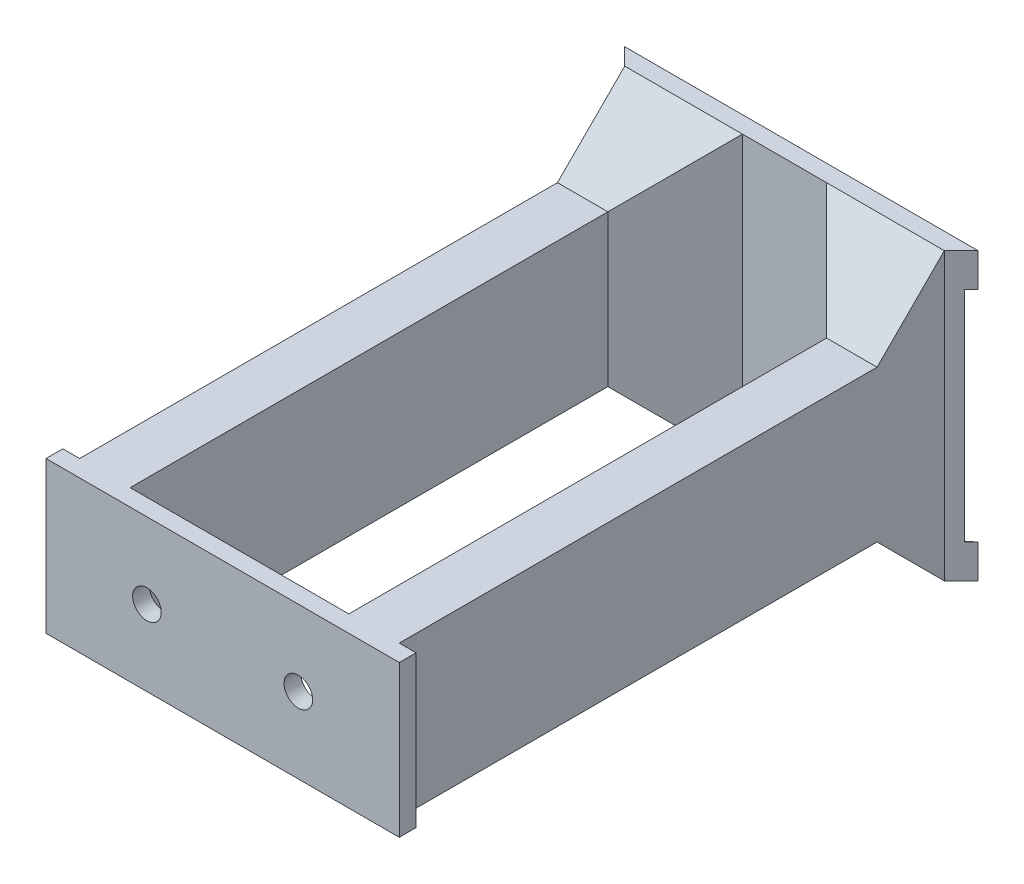
ISO-10303-21;
HEADER;
FILE_DESCRIPTION(('STEP AP214'),'2;1');
FILE_NAME('part.step','',(''),(''),'','','');
FILE_SCHEMA(('AUTOMOTIVE_DESIGN { 1 0 10303 214 1 1 1 1 }'));
ENDSEC;
DATA;
#1=APPLICATION_CONTEXT('core data for automotive mechanical design processes');
#2=APPLICATION_PROTOCOL_DEFINITION('international standard','automotive_design',2000,#1);
#3=PRODUCT_CONTEXT('',#1,'mechanical');
#4=PRODUCT('Part','Part','',(#3));
#5=PRODUCT_RELATED_PRODUCT_CATEGORY('part','',(#4));
#6=PRODUCT_DEFINITION_FORMATION('','',#4);
#7=PRODUCT_DEFINITION_CONTEXT('part definition',#1,'design');
#8=PRODUCT_DEFINITION('design','',#6,#7);
#9=PRODUCT_DEFINITION_SHAPE('','',#8);
#10=(LENGTH_UNIT() NAMED_UNIT(*) SI_UNIT(.MILLI.,.METRE.));
#11=(NAMED_UNIT(*) PLANE_ANGLE_UNIT() SI_UNIT($,.RADIAN.));
#12=(NAMED_UNIT(*) SI_UNIT($,.STERADIAN.) SOLID_ANGLE_UNIT());
#13=UNCERTAINTY_MEASURE_WITH_UNIT(LENGTH_MEASURE(1.E-05),#10,'distance_accuracy_value','');
#14=(GEOMETRIC_REPRESENTATION_CONTEXT(3) GLOBAL_UNCERTAINTY_ASSIGNED_CONTEXT((#13)) GLOBAL_UNIT_ASSIGNED_CONTEXT((#10,
#11,#12)) REPRESENTATION_CONTEXT('',''));
#15=CARTESIAN_POINT('',(0.,0.,0.));
#16=DIRECTION('',(0.,0.,1.));
#17=DIRECTION('',(1.,0.,0.));
#18=AXIS2_PLACEMENT_3D('',#15,#16,#17);
#19=CARTESIAN_POINT('',(-33.5000000000001,42.5,-33.5000000000002));
#20=DIRECTION('',(-0.707106781186546,0.,-0.707106781186548));
#21=DIRECTION('',(-0.707106781186549,0.,0.707106781186547));
#22=AXIS2_PLACEMENT_3D('',#19,#20,#21);
#23=PLANE('',#22);
#24=DIRECTION('',(0.707106781186549,0.,-0.707106781186547));
#25=VECTOR('',#24,1.);
#26=CARTESIAN_POINT('',(-33.5000000000001,-32.5,-33.5000000000002));
#27=LINE('',#26,#25);
#28=CARTESIAN_POINT('',(103.,-32.5,-170.));
#29=VERTEX_POINT('',#28);
#30=CARTESIAN_POINT('',(105.,-32.5,-172.));
#31=VERTEX_POINT('',#30);
#32=EDGE_CURVE('E241',#29,#31,#27,.T.);
#33=ORIENTED_EDGE('',*,*,#32,.F.);
#34=DIRECTION('',(0.,-1.,0.));
#35=VECTOR('',#34,1.);
#36=CARTESIAN_POINT('',(103.,42.5,-170.));
#37=LINE('',#36,#35);
#38=CARTESIAN_POINT('',(103.,32.5,-170.));
#39=VERTEX_POINT('',#38);
#40=EDGE_CURVE('E248',#39,#29,#37,.T.);
#41=ORIENTED_EDGE('',*,*,#40,.F.);
#42=DIRECTION('',(-0.707106781186549,0.,0.707106781186547));
#43=VECTOR('',#42,1.);
#44=CARTESIAN_POINT('',(-33.5000000000001,32.5,-33.5000000000002));
#45=LINE('',#44,#43);
#46=CARTESIAN_POINT('',(105.,32.5,-172.));
#47=VERTEX_POINT('',#46);
#48=EDGE_CURVE('E234',#47,#39,#45,.T.);
#49=ORIENTED_EDGE('',*,*,#48,.F.);
#50=CARTESIAN_POINT('',(105.,42.5,-172.));
#51=DIRECTION('',(0.,-1.,0.));
#52=VECTOR('',#51,1.);
#53=LINE('',#50,#52);
#54=CARTESIAN_POINT('',(105.,42.5,-172.));
#55=VERTEX_POINT('',#54);
#56=EDGE_CURVE('E408',#55,#47,#53,.T.);
#57=ORIENTED_EDGE('',*,*,#56,.F.);
#58=DIRECTION('',(0.707106781186549,0.,-0.707106781186547));
#59=VECTOR('',#58,1.);
#60=CARTESIAN_POINT('',(-33.5000000000001,42.5,-33.5000000000002));
#61=LINE('',#60,#59);
#62=CARTESIAN_POINT('',(100.,42.5,-167.));
#63=VERTEX_POINT('',#62);
#64=EDGE_CURVE('E335',#63,#55,#61,.T.);
#65=ORIENTED_EDGE('',*,*,#64,.F.);
#66=DIRECTION('',(0.,-1.,0.));
#67=VECTOR('',#66,1.);
#68=CARTESIAN_POINT('',(100.,42.5,-167.));
#69=LINE('',#68,#67);
#70=CARTESIAN_POINT('',(99.9999999999999,-42.5,-167.));
#71=VERTEX_POINT('',#70);
#72=EDGE_CURVE('E400',#63,#71,#69,.T.);
#73=ORIENTED_EDGE('',*,*,#72,.T.);
#74=DIRECTION('',(0.707106781186549,0.,-0.707106781186547));
#75=VECTOR('',#74,1.);
#76=CARTESIAN_POINT('',(-33.5000000000001,-42.5,-33.5000000000002));
#77=LINE('',#76,#75);
#78=CARTESIAN_POINT('',(105.,-42.5,-172.));
#79=VERTEX_POINT('',#78);
#80=EDGE_CURVE('E375',#71,#79,#77,.T.);
#81=ORIENTED_EDGE('',*,*,#80,.T.);
#82=CARTESIAN_POINT('',(105.,-32.5,-172.));
#83=DIRECTION('',(0.,-1.,0.));
#84=VECTOR('',#83,1.);
#85=LINE('',#82,#84);
#86=EDGE_CURVE('E115',#31,#79,#85,.T.);
#87=ORIENTED_EDGE('',*,*,#86,.F.);
#88=EDGE_LOOP('',(#33,#41,#49,#57,#65,#73,#81,#87));
#89=FACE_BOUND('',#88,.T.);
#90=ADVANCED_FACE('F49',(#89),#23,.F.);
#91=CARTESIAN_POINT('',(-42.9268292682925,0.,-53.6585365853653));
#92=DIRECTION('',(0.624695047554426,0.,0.780868809443029));
#93=DIRECTION('',(0.780868809443029,0.,-0.624695047554426));
#94=AXIS2_PLACEMENT_3D('',#91,#92,#93);
#95=PLANE('',#94);
#96=DIRECTION('',(-0.780868809443029,0.,0.624695047554426));
#97=VECTOR('',#96,1.);
#98=CARTESIAN_POINT('',(-42.9268292682925,-32.5,-53.6585365853653));
#99=LINE('',#98,#97);
#100=CARTESIAN_POINT('',(102.5,-32.5,-170.));
#101=VERTEX_POINT('',#100);
#102=EDGE_CURVE('E594',#31,#101,#99,.T.);
#103=ORIENTED_EDGE('',*,*,#102,.F.);
#104=ORIENTED_EDGE('',*,*,#86,.T.);
#105=DIRECTION('',(0.615457454896662,-0.615457454896665,-0.492365963917332));
#106=VECTOR('',#105,1.);
#107=CARTESIAN_POINT('',(102.5,-40.,-170.));
#108=LINE('',#107,#106);
#109=CARTESIAN_POINT('',(102.5,-40.,-170.));
#110=VERTEX_POINT('',#109);
#111=EDGE_CURVE('E534',#110,#79,#108,.T.);
#112=ORIENTED_EDGE('',*,*,#111,.F.);
#113=DIRECTION('',(0.,-1.,0.));
#114=VECTOR('',#113,1.);
#115=CARTESIAN_POINT('',(102.5,40.,-170.));
#116=LINE('',#115,#114);
#117=EDGE_CURVE('E269',#101,#110,#116,.T.);
#118=ORIENTED_EDGE('',*,*,#117,.F.);
#119=EDGE_LOOP('',(#103,#104,#112,#118));
#120=FACE_BOUND('',#119,.T.);
#121=ADVANCED_FACE('F294',(#120),#95,.F.);
#122=DIRECTION('',(0.780868809443029,0.,-0.624695047554426));
#123=VECTOR('',#122,1.);
#124=CARTESIAN_POINT('',(-42.9268292682925,32.5,-53.6585365853653));
#125=LINE('',#124,#123);
#126=CARTESIAN_POINT('',(102.5,32.5,-170.));
#127=VERTEX_POINT('',#126);
#128=EDGE_CURVE('E236',#127,#47,#125,.T.);
#129=ORIENTED_EDGE('',*,*,#128,.F.);
#130=CARTESIAN_POINT('',(102.5,40.,-170.));
#131=VERTEX_POINT('',#130);
#132=EDGE_CURVE('E251',#131,#127,#116,.T.);
#133=ORIENTED_EDGE('',*,*,#132,.F.);
#134=DIRECTION('',(0.615457454896662,0.615457454896665,-0.492365963917332));
#135=VECTOR('',#134,1.);
#136=CARTESIAN_POINT('',(102.5,40.,-170.));
#137=LINE('',#136,#135);
#138=EDGE_CURVE('E277',#131,#55,#137,.T.);
#139=ORIENTED_EDGE('',*,*,#138,.T.);
#140=ORIENTED_EDGE('',*,*,#56,.T.);
#141=EDGE_LOOP('',(#129,#133,#139,#140));
#142=FACE_BOUND('',#141,.T.);
#143=ADVANCED_FACE('F583',(#142),#95,.F.);
#144=CARTESIAN_POINT('',(86.,42.5,-85.9999999999989));
#145=DIRECTION('',(-0.707106781186552,0.,0.707106781186543));
#146=DIRECTION('',(0.707106781186543,0.,0.707106781186552));
#147=AXIS2_PLACEMENT_3D('',#144,#145,#146);
#148=PLANE('',#147);
#149=DIRECTION('',(-0.707106781186543,0.,-0.707106781186552));
#150=VECTOR('',#149,1.);
#151=CARTESIAN_POINT('',(86.,42.5,-85.9999999999989));
#152=LINE('',#151,#150);
#153=CARTESIAN_POINT('',(4.99999999999998,42.5,-167.));
#154=VERTEX_POINT('',#153);
#155=CARTESIAN_POINT('',(0.,42.5,-172.));
#156=VERTEX_POINT('',#155);
#157=EDGE_CURVE('E321',#154,#156,#152,.T.);
#158=ORIENTED_EDGE('',*,*,#157,.T.);
#159=DIRECTION('',(0.529812942826013,-0.662266178532524,0.529812942826019));
#160=VECTOR('',#159,1.);
#161=CARTESIAN_POINT('',(48.2807017543857,-17.8508771929829,-123.719298245614));
#162=LINE('',#161,#160);
#163=CARTESIAN_POINT('',(1.99999999999996,40.,-170.));
#164=VERTEX_POINT('',#163);
#165=EDGE_CURVE('E385',#156,#164,#162,.T.);
#166=ORIENTED_EDGE('',*,*,#165,.T.);
#167=DIRECTION('',(0.,-1.,0.));
#168=VECTOR('',#167,1.);
#169=CARTESIAN_POINT('',(1.99999999999997,42.5,-170.));
#170=LINE('',#169,#168);
#171=CARTESIAN_POINT('',(1.99999999999995,-40.,-170.));
#172=VERTEX_POINT('',#171);
#173=EDGE_CURVE('E388',#164,#172,#170,.T.);
#174=ORIENTED_EDGE('',*,*,#173,.T.);
#175=DIRECTION('',(0.529812942826013,0.662266178532524,0.529812942826019));
#176=VECTOR('',#175,1.);
#177=CARTESIAN_POINT('',(78.1052631578943,55.1315789473692,-93.8947368421047));
#178=LINE('',#177,#176);
#179=CARTESIAN_POINT('',(0.,-42.5,-172.));
#180=VERTEX_POINT('',#179);
#181=EDGE_CURVE('E484',#180,#172,#178,.T.);
#182=ORIENTED_EDGE('',*,*,#181,.F.);
#183=DIRECTION('',(-0.707106781186543,0.,-0.707106781186552));
#184=VECTOR('',#183,1.);
#185=CARTESIAN_POINT('',(86.,-42.5,-85.9999999999989));
#186=LINE('',#185,#184);
#187=CARTESIAN_POINT('',(4.99999999999997,-42.5,-167.));
#188=VERTEX_POINT('',#187);
#189=EDGE_CURVE('E363',#188,#180,#186,.T.);
#190=ORIENTED_EDGE('',*,*,#189,.F.);
#191=DIRECTION('',(0.,-1.,0.));
#192=VECTOR('',#191,1.);
#193=CARTESIAN_POINT('',(4.99999999999997,42.5,-167.));
#194=LINE('',#193,#192);
#195=EDGE_CURVE('E409',#154,#188,#194,.T.);
#196=ORIENTED_EDGE('',*,*,#195,.F.);
#197=EDGE_LOOP('',(#158,#166,#174,#182,#190,#196));
#198=FACE_BOUND('',#197,.T.);
#199=ADVANCED_FACE('F580',(#198),#148,.T.);
#200=CARTESIAN_POINT('',(100.,42.5,0.));
#201=DIRECTION('',(-1.,0.,0.));
#202=DIRECTION('',(0.,0.,1.));
#203=AXIS2_PLACEMENT_3D('',#200,#201,#202);
#204=PLANE('',#203);
#205=DIRECTION('',(0.,0.,-1.));
#206=VECTOR('',#205,1.);
#207=CARTESIAN_POINT('',(100.,-22.5,0.));
#208=LINE('',#207,#206);
#209=CARTESIAN_POINT('',(100.,-22.5,-5.));
#210=VERTEX_POINT('',#209);
#211=CARTESIAN_POINT('',(100.,-22.5,-147.));
#212=VERTEX_POINT('',#211);
#213=EDGE_CURVE('E467',#210,#212,#208,.T.);
#214=ORIENTED_EDGE('',*,*,#213,.T.);
#215=DIRECTION('',(0.,-0.707106781186549,-0.707106781186546));
#216=VECTOR('',#215,1.);
#217=CARTESIAN_POINT('',(100.,83.5000000000001,-41.0000000000003));
#218=LINE('',#217,#216);
#219=EDGE_CURVE('E470',#212,#71,#218,.T.);
#220=ORIENTED_EDGE('',*,*,#219,.T.);
#221=ORIENTED_EDGE('',*,*,#72,.F.);
#222=DIRECTION('',(0.,0.707106781186549,-0.707106781186546));
#223=VECTOR('',#222,1.);
#224=CARTESIAN_POINT('',(100.,-41.,-83.5000000000003));
#225=LINE('',#224,#223);
#226=CARTESIAN_POINT('',(100.,22.5,-147.));
#227=VERTEX_POINT('',#226);
#228=EDGE_CURVE('E103',#227,#63,#225,.T.);
#229=ORIENTED_EDGE('',*,*,#228,.F.);
#230=DIRECTION('',(0.,0.,-1.));
#231=VECTOR('',#230,1.);
#232=CARTESIAN_POINT('',(100.,22.5,0.));
#233=LINE('',#232,#231);
#234=CARTESIAN_POINT('',(100.,22.5,-5.));
#235=VERTEX_POINT('',#234);
#236=EDGE_CURVE('E438',#235,#227,#233,.T.);
#237=ORIENTED_EDGE('',*,*,#236,.F.);
#238=DIRECTION('',(0.,-1.,0.));
#239=VECTOR('',#238,1.);
#240=CARTESIAN_POINT('',(100.,42.5,-5.));
#241=LINE('',#240,#239);
#242=EDGE_CURVE('E404',#235,#210,#241,.T.);
#243=ORIENTED_EDGE('',*,*,#242,.T.);
#244=EDGE_LOOP('',(#214,#220,#221,#229,#237,#243));
#245=FACE_BOUND('',#244,.T.);
#246=ADVANCED_FACE('F647',(#245),#204,.F.);
#247=CARTESIAN_POINT('',(5.,42.5,0.));
#248=DIRECTION('',(-1.,0.,0.));
#249=DIRECTION('',(0.,0.,1.));
#250=AXIS2_PLACEMENT_3D('',#247,#248,#249);
#251=PLANE('',#250);
#252=DIRECTION('',(0.,-0.707106781186549,-0.707106781186546));
#253=VECTOR('',#252,1.);
#254=CARTESIAN_POINT('',(4.99999999999999,83.5000000000001,-41.0000000000003));
#255=LINE('',#254,#253);
#256=CARTESIAN_POINT('',(4.99999999999999,-22.5,-147.));
#257=VERTEX_POINT('',#256);
#258=EDGE_CURVE('E473',#257,#188,#255,.T.);
#259=ORIENTED_EDGE('',*,*,#258,.F.);
#260=DIRECTION('',(0.,0.,-1.));
#261=VECTOR('',#260,1.);
#262=CARTESIAN_POINT('',(5.,-22.5,0.));
#263=LINE('',#262,#261);
#264=CARTESIAN_POINT('',(5.,-22.5,-5.));
#265=VERTEX_POINT('',#264);
#266=EDGE_CURVE('E454',#265,#257,#263,.T.);
#267=ORIENTED_EDGE('',*,*,#266,.F.);
#268=DIRECTION('',(0.,-1.,0.));
#269=VECTOR('',#268,1.);
#270=CARTESIAN_POINT('',(5.,42.5,-5.));
#271=LINE('',#270,#269);
#272=CARTESIAN_POINT('',(5.,22.5,-5.));
#273=VERTEX_POINT('',#272);
#274=EDGE_CURVE('E412',#273,#265,#271,.T.);
#275=ORIENTED_EDGE('',*,*,#274,.F.);
#276=DIRECTION('',(0.,0.,-1.));
#277=VECTOR('',#276,1.);
#278=CARTESIAN_POINT('',(5.,22.5,0.));
#279=LINE('',#278,#277);
#280=CARTESIAN_POINT('',(4.99999999999996,22.5,-147.));
#281=VERTEX_POINT('',#280);
#282=EDGE_CURVE('E124',#273,#281,#279,.T.);
#283=ORIENTED_EDGE('',*,*,#282,.T.);
#284=DIRECTION('',(0.,0.707106781186549,-0.707106781186546));
#285=VECTOR('',#284,1.);
#286=CARTESIAN_POINT('',(4.99999999999998,-41.,-83.5000000000003));
#287=LINE('',#286,#285);
#288=EDGE_CURVE('E441',#281,#154,#287,.T.);
#289=ORIENTED_EDGE('',*,*,#288,.T.);
#290=ORIENTED_EDGE('',*,*,#195,.T.);
#291=EDGE_LOOP('',(#259,#267,#275,#283,#289,#290));
#292=FACE_BOUND('',#291,.T.);
#293=ADVANCED_FACE('F625',(#292),#251,.T.);
#294=CARTESIAN_POINT('',(0.,42.5,-5.));
#295=DIRECTION('',(0.,0.,-1.));
#296=DIRECTION('',(-1.,0.,0.));
#297=AXIS2_PLACEMENT_3D('',#294,#295,#296);
#298=PLANE('',#297);
#299=DIRECTION('',(1.,0.,0.));
#300=VECTOR('',#299,1.);
#301=CARTESIAN_POINT('',(0.,-22.5,-5.));
#302=LINE('',#301,#300);
#303=CARTESIAN_POINT('',(0.,-22.5,-5.));
#304=VERTEX_POINT('',#303);
#305=EDGE_CURVE('E457',#304,#265,#302,.T.);
#306=ORIENTED_EDGE('',*,*,#305,.F.);
#307=DIRECTION('',(0.,-1.,0.));
#308=VECTOR('',#307,1.);
#309=CARTESIAN_POINT('',(0.,42.5,-5.));
#310=LINE('',#309,#308);
#311=CARTESIAN_POINT('',(0.,22.5,-5.));
#312=VERTEX_POINT('',#311);
#313=EDGE_CURVE('E415',#312,#304,#310,.T.);
#314=ORIENTED_EDGE('',*,*,#313,.F.);
#315=DIRECTION('',(1.,0.,0.));
#316=VECTOR('',#315,1.);
#317=CARTESIAN_POINT('',(0.,22.5,-5.));
#318=LINE('',#317,#316);
#319=EDGE_CURVE('E430',#312,#273,#318,.T.);
#320=ORIENTED_EDGE('',*,*,#319,.T.);
#321=ORIENTED_EDGE('',*,*,#274,.T.);
#322=EDGE_LOOP('',(#306,#314,#320,#321));
#323=FACE_BOUND('',#322,.T.);
#324=ADVANCED_FACE('F628',(#323),#298,.T.);
#325=CARTESIAN_POINT('',(0.,42.5,0.));
#326=DIRECTION('',(-1.,0.,0.));
#327=DIRECTION('',(0.,0.,1.));
#328=AXIS2_PLACEMENT_3D('',#325,#326,#327);
#329=PLANE('',#328);
#330=DIRECTION('',(0.,0.,-1.));
#331=VECTOR('',#330,1.);
#332=CARTESIAN_POINT('',(0.,-22.5,0.));
#333=LINE('',#332,#331);
#334=CARTESIAN_POINT('',(0.,-22.5,0.));
#335=VERTEX_POINT('',#334);
#336=EDGE_CURVE('E482',#335,#304,#333,.T.);
#337=ORIENTED_EDGE('',*,*,#336,.F.);
#338=DIRECTION('',(0.,-1.,0.));
#339=VECTOR('',#338,1.);
#340=CARTESIAN_POINT('',(0.,42.5,0.));
#341=LINE('',#340,#339);
#342=CARTESIAN_POINT('',(0.,22.5,0.));
#343=VERTEX_POINT('',#342);
#344=EDGE_CURVE('E418',#343,#335,#341,.T.);
#345=ORIENTED_EDGE('',*,*,#344,.F.);
#346=DIRECTION('',(0.,0.,-1.));
#347=VECTOR('',#346,1.);
#348=CARTESIAN_POINT('',(0.,22.5,0.));
#349=LINE('',#348,#347);
#350=EDGE_CURVE('E451',#343,#312,#349,.T.);
#351=ORIENTED_EDGE('',*,*,#350,.T.);
#352=ORIENTED_EDGE('',*,*,#313,.T.);
#353=EDGE_LOOP('',(#337,#345,#351,#352));
#354=FACE_BOUND('',#353,.T.);
#355=ADVANCED_FACE('F633',(#354),#329,.T.);
#356=CARTESIAN_POINT('',(0.,42.5,0.));
#357=DIRECTION('',(0.,0.,-1.));
#358=DIRECTION('',(-1.,0.,0.));
#359=AXIS2_PLACEMENT_3D('',#356,#357,#358);
#360=PLANE('',#359);
#361=CARTESIAN_POINT('',(30.,0.,0.));
#362=DIRECTION('',(0.,0.,1.));
#363=DIRECTION('',(1.,0.,0.));
#364=AXIS2_PLACEMENT_3D('',#361,#362,#363);
#365=CIRCLE('',#364,4.25000000000001);
#366=CARTESIAN_POINT('',(34.25,0.,0.));
#367=VERTEX_POINT('',#366);
#368=EDGE_CURVE('E267',#367,#367,#365,.T.);
#369=ORIENTED_EDGE('',*,*,#368,.F.);
#370=EDGE_LOOP('',(#369));
#371=FACE_BOUND('',#370,.T.);
#372=CARTESIAN_POINT('',(75.,0.,0.));
#373=DIRECTION('',(0.,0.,1.));
#374=DIRECTION('',(1.,0.,0.));
#375=AXIS2_PLACEMENT_3D('',#372,#373,#374);
#376=CIRCLE('',#375,4.25000000000001);
#377=CARTESIAN_POINT('',(79.25,0.,0.));
#378=VERTEX_POINT('',#377);
#379=EDGE_CURVE('E255',#378,#378,#376,.T.);
#380=ORIENTED_EDGE('',*,*,#379,.F.);
#381=EDGE_LOOP('',(#380));
#382=FACE_BOUND('',#381,.T.);
#383=ORIENTED_EDGE('',*,*,#344,.T.);
#384=DIRECTION('',(-1.,0.,0.));
#385=VECTOR('',#384,1.);
#386=CARTESIAN_POINT('',(105.,-22.5,0.));
#387=LINE('',#386,#385);
#388=CARTESIAN_POINT('',(105.,-22.5,0.));
#389=VERTEX_POINT('',#388);
#390=EDGE_CURVE('E479',#389,#335,#387,.T.);
#391=ORIENTED_EDGE('',*,*,#390,.F.);
#392=DIRECTION('',(0.,-1.,0.));
#393=VECTOR('',#392,1.);
#394=CARTESIAN_POINT('',(105.,42.5,0.));
#395=LINE('',#394,#393);
#396=CARTESIAN_POINT('',(105.,22.5,0.));
#397=VERTEX_POINT('',#396);
#398=EDGE_CURVE('E421',#397,#389,#395,.T.);
#399=ORIENTED_EDGE('',*,*,#398,.F.);
#400=DIRECTION('',(-1.,0.,0.));
#401=VECTOR('',#400,1.);
#402=CARTESIAN_POINT('',(105.,22.5,0.));
#403=LINE('',#402,#401);
#404=EDGE_CURVE('E444',#397,#343,#403,.T.);
#405=ORIENTED_EDGE('',*,*,#404,.T.);
#406=EDGE_LOOP('',(#383,#391,#399,#405));
#407=FACE_BOUND('',#406,.T.);
#408=ADVANCED_FACE('F636',(#371,#382,#407),#360,.F.);
#409=CARTESIAN_POINT('',(105.,42.5,0.));
#410=DIRECTION('',(-1.,0.,0.));
#411=DIRECTION('',(0.,0.,1.));
#412=AXIS2_PLACEMENT_3D('',#409,#410,#411);
#413=PLANE('',#412);
#414=ORIENTED_EDGE('',*,*,#398,.T.);
#415=DIRECTION('',(0.,0.,-1.));
#416=VECTOR('',#415,1.);
#417=CARTESIAN_POINT('',(105.,-22.5,0.));
#418=LINE('',#417,#416);
#419=CARTESIAN_POINT('',(105.,-22.5,-5.));
#420=VERTEX_POINT('',#419);
#421=EDGE_CURVE('E481',#389,#420,#418,.T.);
#422=ORIENTED_EDGE('',*,*,#421,.T.);
#423=DIRECTION('',(0.,-1.,0.));
#424=VECTOR('',#423,1.);
#425=CARTESIAN_POINT('',(105.,42.5,-5.));
#426=LINE('',#425,#424);
#427=CARTESIAN_POINT('',(105.,22.5,-5.));
#428=VERTEX_POINT('',#427);
#429=EDGE_CURVE('E424',#428,#420,#426,.T.);
#430=ORIENTED_EDGE('',*,*,#429,.F.);
#431=DIRECTION('',(0.,0.,-1.));
#432=VECTOR('',#431,1.);
#433=CARTESIAN_POINT('',(105.,22.5,0.));
#434=LINE('',#433,#432);
#435=EDGE_CURVE('E450',#397,#428,#434,.T.);
#436=ORIENTED_EDGE('',*,*,#435,.F.);
#437=EDGE_LOOP('',(#414,#422,#430,#436));
#438=FACE_BOUND('',#437,.T.);
#439=ADVANCED_FACE('F641',(#438),#413,.F.);
#440=CARTESIAN_POINT('',(85.,42.5,0.));
#441=DIRECTION('',(-1.,0.,0.));
#442=DIRECTION('',(0.,0.,1.));
#443=AXIS2_PLACEMENT_3D('',#440,#441,#442);
#444=PLANE('',#443);
#445=DIRECTION('',(0.,0.,-1.));
#446=VECTOR('',#445,1.);
#447=CARTESIAN_POINT('',(85.,22.5,0.));
#448=LINE('',#447,#446);
#449=CARTESIAN_POINT('',(85.,22.5,-5.));
#450=VERTEX_POINT('',#449);
#451=CARTESIAN_POINT('',(85.,22.5,-147.));
#452=VERTEX_POINT('',#451);
#453=EDGE_CURVE('E131',#450,#452,#448,.T.);
#454=ORIENTED_EDGE('',*,*,#453,.T.);
#455=DIRECTION('',(0.,-1.,0.));
#456=VECTOR('',#455,1.);
#457=CARTESIAN_POINT('',(85.,42.5,-147.));
#458=LINE('',#457,#456);
#459=CARTESIAN_POINT('',(85.,-22.5,-147.));
#460=VERTEX_POINT('',#459);
#461=EDGE_CURVE('E590',#452,#460,#458,.T.);
#462=ORIENTED_EDGE('',*,*,#461,.T.);
#463=DIRECTION('',(0.,0.,-1.));
#464=VECTOR('',#463,1.);
#465=CARTESIAN_POINT('',(85.,-22.5,0.));
#466=LINE('',#465,#464);
#467=CARTESIAN_POINT('',(85.,-22.5,-5.));
#468=VERTEX_POINT('',#467);
#469=EDGE_CURVE('E459',#468,#460,#466,.T.);
#470=ORIENTED_EDGE('',*,*,#469,.F.);
#471=DIRECTION('',(0.,-1.,0.));
#472=VECTOR('',#471,1.);
#473=CARTESIAN_POINT('',(85.,42.5,-5.));
#474=LINE('',#473,#472);
#475=EDGE_CURVE('E401',#450,#468,#474,.T.);
#476=ORIENTED_EDGE('',*,*,#475,.F.);
#477=EDGE_LOOP('',(#454,#462,#470,#476));
#478=FACE_BOUND('',#477,.T.);
#479=ADVANCED_FACE('F659',(#478),#444,.T.);
#480=CARTESIAN_POINT('',(0.,42.5,-4.99999999999998));
#481=DIRECTION('',(0.,0.,-1.));
#482=DIRECTION('',(-1.,0.,0.));
#483=AXIS2_PLACEMENT_3D('',#480,#481,#482);
#484=PLANE('',#483);
#485=CARTESIAN_POINT('',(30.,0.,-4.99999999999998));
#486=DIRECTION('',(0.,0.,-1.));
#487=DIRECTION('',(-1.,0.,0.));
#488=AXIS2_PLACEMENT_3D('',#485,#486,#487);
#489=CIRCLE('',#488,4.25000000000001);
#490=CARTESIAN_POINT('',(25.75,0.,-4.99999999999998));
#491=VERTEX_POINT('',#490);
#492=EDGE_CURVE('E264',#491,#491,#489,.F.);
#493=ORIENTED_EDGE('',*,*,#492,.T.);
#494=EDGE_LOOP('',(#493));
#495=FACE_BOUND('',#494,.T.);
#496=CARTESIAN_POINT('',(75.,0.,-5.));
#497=DIRECTION('',(0.,0.,-1.));
#498=DIRECTION('',(-1.,0.,0.));
#499=AXIS2_PLACEMENT_3D('',#496,#497,#498);
#500=CIRCLE('',#499,4.25000000000001);
#501=CARTESIAN_POINT('',(70.75,0.,-5.));
#502=VERTEX_POINT('',#501);
#503=EDGE_CURVE('E258',#502,#502,#500,.F.);
#504=ORIENTED_EDGE('',*,*,#503,.T.);
#505=EDGE_LOOP('',(#504));
#506=FACE_BOUND('',#505,.T.);
#507=DIRECTION('',(1.,0.,0.));
#508=VECTOR('',#507,1.);
#509=CARTESIAN_POINT('',(0.,-22.5,-4.99999999999998));
#510=LINE('',#509,#508);
#511=CARTESIAN_POINT('',(20.,-22.5,-4.99999999999998));
#512=VERTEX_POINT('',#511);
#513=EDGE_CURVE('E462',#512,#468,#510,.T.);
#514=ORIENTED_EDGE('',*,*,#513,.F.);
#515=DIRECTION('',(0.,-1.,0.));
#516=VECTOR('',#515,1.);
#517=CARTESIAN_POINT('',(20.,42.5,-4.99999999999998));
#518=LINE('',#517,#516);
#519=CARTESIAN_POINT('',(20.,22.5,-4.99999999999998));
#520=VERTEX_POINT('',#519);
#521=EDGE_CURVE('E324',#520,#512,#518,.T.);
#522=ORIENTED_EDGE('',*,*,#521,.F.);
#523=DIRECTION('',(1.,0.,0.));
#524=VECTOR('',#523,1.);
#525=CARTESIAN_POINT('',(0.,22.5,-4.99999999999998));
#526=LINE('',#525,#524);
#527=EDGE_CURVE('E433',#520,#450,#526,.T.);
#528=ORIENTED_EDGE('',*,*,#527,.T.);
#529=ORIENTED_EDGE('',*,*,#475,.T.);
#530=EDGE_LOOP('',(#514,#522,#528,#529));
#531=FACE_BOUND('',#530,.T.);
#532=ADVANCED_FACE('F684',(#495,#506,#531),#484,.T.);
#533=CARTESIAN_POINT('',(20.,42.5,0.));
#534=DIRECTION('',(-1.,0.,0.));
#535=DIRECTION('',(0.,0.,1.));
#536=AXIS2_PLACEMENT_3D('',#533,#534,#535);
#537=PLANE('',#536);
#538=DIRECTION('',(0.,0.,-1.));
#539=VECTOR('',#538,1.);
#540=CARTESIAN_POINT('',(20.,-22.5,0.));
#541=LINE('',#540,#539);
#542=CARTESIAN_POINT('',(20.,-22.5,-147.));
#543=VERTEX_POINT('',#542);
#544=EDGE_CURVE('E464',#512,#543,#541,.T.);
#545=ORIENTED_EDGE('',*,*,#544,.T.);
#546=DIRECTION('',(0.,1.,0.));
#547=VECTOR('',#546,1.);
#548=CARTESIAN_POINT('',(20.,42.5,-147.));
#549=LINE('',#548,#547);
#550=CARTESIAN_POINT('',(19.9999999999999,22.5,-147.));
#551=VERTEX_POINT('',#550);
#552=EDGE_CURVE('E600',#543,#551,#549,.T.);
#553=ORIENTED_EDGE('',*,*,#552,.T.);
#554=DIRECTION('',(0.,0.,-1.));
#555=VECTOR('',#554,1.);
#556=CARTESIAN_POINT('',(20.,22.5,0.));
#557=LINE('',#556,#555);
#558=EDGE_CURVE('E435',#520,#551,#557,.T.);
#559=ORIENTED_EDGE('',*,*,#558,.F.);
#560=ORIENTED_EDGE('',*,*,#521,.T.);
#561=EDGE_LOOP('',(#545,#553,#559,#560));
#562=FACE_BOUND('',#561,.T.);
#563=ADVANCED_FACE('F616',(#562),#537,.F.);
#564=CARTESIAN_POINT('',(0.,42.5,-4.99999999999998));
#565=DIRECTION('',(0.,0.,-1.));
#566=DIRECTION('',(-1.,0.,0.));
#567=AXIS2_PLACEMENT_3D('',#564,#565,#566);
#568=PLANE('',#567);
#569=DIRECTION('',(1.,0.,0.));
#570=VECTOR('',#569,1.);
#571=CARTESIAN_POINT('',(0.,-22.5,-4.99999999999998));
#572=LINE('',#571,#570);
#573=EDGE_CURVE('E392',#210,#420,#572,.T.);
#574=ORIENTED_EDGE('',*,*,#573,.F.);
#575=ORIENTED_EDGE('',*,*,#242,.F.);
#576=DIRECTION('',(1.,0.,0.));
#577=VECTOR('',#576,1.);
#578=CARTESIAN_POINT('',(0.,22.5,-4.99999999999998));
#579=LINE('',#578,#577);
#580=EDGE_CURVE('E395',#235,#428,#579,.T.);
#581=ORIENTED_EDGE('',*,*,#580,.T.);
#582=ORIENTED_EDGE('',*,*,#429,.T.);
#583=EDGE_LOOP('',(#574,#575,#581,#582));
#584=FACE_BOUND('',#583,.T.);
#585=ADVANCED_FACE('F348',(#584),#568,.T.);
#586=CARTESIAN_POINT('',(0.,42.5,0.));
#587=DIRECTION('',(0.,1.,0.));
#588=DIRECTION('',(0.,0.,1.));
#589=AXIS2_PLACEMENT_3D('',#586,#587,#588);
#590=PLANE('',#589);
#591=ORIENTED_EDGE('',*,*,#157,.F.);
#592=DIRECTION('',(1.,0.,0.));
#593=VECTOR('',#592,1.);
#594=CARTESIAN_POINT('',(0.,42.5,-167.));
#595=LINE('',#594,#593);
#596=CARTESIAN_POINT('',(40.0000000000001,42.5,-167.));
#597=VERTEX_POINT('',#596);
#598=EDGE_CURVE('E65',#154,#597,#595,.T.);
#599=ORIENTED_EDGE('',*,*,#598,.T.);
#600=DIRECTION('',(1.,0.,0.));
#601=VECTOR('',#600,1.);
#602=CARTESIAN_POINT('',(0.,42.5,-167.));
#603=LINE('',#602,#601);
#604=CARTESIAN_POINT('',(65.,42.5,-167.));
#605=VERTEX_POINT('',#604);
#606=EDGE_CURVE('E370',#597,#605,#603,.T.);
#607=ORIENTED_EDGE('',*,*,#606,.T.);
#608=EDGE_CURVE('E398',#605,#63,#595,.T.);
#609=ORIENTED_EDGE('',*,*,#608,.T.);
#610=ORIENTED_EDGE('',*,*,#64,.T.);
#611=CARTESIAN_POINT('',(0.,42.5000000000001,-172.));
#612=DIRECTION('',(1.,0.,0.));
#613=VECTOR('',#612,1.);
#614=LINE('',#611,#613);
#615=EDGE_CURVE('E325',#156,#55,#614,.T.);
#616=ORIENTED_EDGE('',*,*,#615,.F.);
#617=EDGE_LOOP('',(#591,#599,#607,#609,#610,#616));
#618=FACE_BOUND('',#617,.T.);
#619=ADVANCED_FACE('F337',(#618),#590,.T.);
#620=CARTESIAN_POINT('',(0.,42.5,-167.));
#621=DIRECTION('',(0.,0.,-1.));
#622=DIRECTION('',(-1.,0.,0.));
#623=AXIS2_PLACEMENT_3D('',#620,#621,#622);
#624=PLANE('',#623);
#625=DIRECTION('',(1.,0.,0.));
#626=VECTOR('',#625,1.);
#627=CARTESIAN_POINT('',(0.,-42.5,-167.));
#628=LINE('',#627,#626);
#629=CARTESIAN_POINT('',(40.0000000000001,-42.5,-167.));
#630=VERTEX_POINT('',#629);
#631=CARTESIAN_POINT('',(65.,-42.5,-167.));
#632=VERTEX_POINT('',#631);
#633=EDGE_CURVE('E377',#630,#632,#628,.T.);
#634=ORIENTED_EDGE('',*,*,#633,.T.);
#635=DIRECTION('',(0.,1.,0.));
#636=VECTOR('',#635,1.);
#637=CARTESIAN_POINT('',(65.,42.5,-167.));
#638=LINE('',#637,#636);
#639=EDGE_CURVE('E597',#632,#605,#638,.T.);
#640=ORIENTED_EDGE('',*,*,#639,.T.);
#641=ORIENTED_EDGE('',*,*,#606,.F.);
#642=DIRECTION('',(0.,-1.,0.));
#643=VECTOR('',#642,1.);
#644=CARTESIAN_POINT('',(40.0000000000001,-42.5,-167.));
#645=LINE('',#644,#643);
#646=EDGE_CURVE('E593',#597,#630,#645,.T.);
#647=ORIENTED_EDGE('',*,*,#646,.T.);
#648=EDGE_LOOP('',(#634,#640,#641,#647));
#649=FACE_BOUND('',#648,.T.);
#650=ADVANCED_FACE('F347',(#649),#624,.F.);
#651=CARTESIAN_POINT('',(0.,-42.5,0.));
#652=DIRECTION('',(0.,1.,0.));
#653=DIRECTION('',(0.,0.,1.));
#654=AXIS2_PLACEMENT_3D('',#651,#652,#653);
#655=PLANE('',#654);
#656=ORIENTED_EDGE('',*,*,#80,.F.);
#657=DIRECTION('',(-1.,0.,0.));
#658=VECTOR('',#657,1.);
#659=CARTESIAN_POINT('',(0.,-42.5,-167.));
#660=LINE('',#659,#658);
#661=EDGE_CURVE('E74',#71,#632,#660,.T.);
#662=ORIENTED_EDGE('',*,*,#661,.T.);
#663=ORIENTED_EDGE('',*,*,#633,.F.);
#664=EDGE_CURVE('E87',#630,#188,#660,.T.);
#665=ORIENTED_EDGE('',*,*,#664,.T.);
#666=ORIENTED_EDGE('',*,*,#189,.T.);
#667=CARTESIAN_POINT('',(0.,-42.5,-172.));
#668=DIRECTION('',(1.,0.,0.));
#669=VECTOR('',#668,1.);
#670=LINE('',#667,#669);
#671=EDGE_CURVE('E371',#180,#79,#670,.T.);
#672=ORIENTED_EDGE('',*,*,#671,.T.);
#673=EDGE_LOOP('',(#656,#662,#663,#665,#666,#672));
#674=FACE_BOUND('',#673,.T.);
#675=ADVANCED_FACE('F351',(#674),#655,.F.);
#676=CARTESIAN_POINT('',(105.,22.5,0.));
#677=DIRECTION('',(0.,1.,0.));
#678=DIRECTION('',(0.,0.,1.));
#679=AXIS2_PLACEMENT_3D('',#676,#677,#678);
#680=PLANE('',#679);
#681=ORIENTED_EDGE('',*,*,#319,.F.);
#682=ORIENTED_EDGE('',*,*,#350,.F.);
#683=ORIENTED_EDGE('',*,*,#404,.F.);
#684=ORIENTED_EDGE('',*,*,#435,.T.);
#685=ORIENTED_EDGE('',*,*,#580,.F.);
#686=ORIENTED_EDGE('',*,*,#236,.T.);
#687=DIRECTION('',(-1.,0.,0.));
#688=VECTOR('',#687,1.);
#689=CARTESIAN_POINT('',(105.,22.5,-147.));
#690=LINE('',#689,#688);
#691=EDGE_CURVE('E447',#227,#452,#690,.T.);
#692=ORIENTED_EDGE('',*,*,#691,.T.);
#693=ORIENTED_EDGE('',*,*,#453,.F.);
#694=ORIENTED_EDGE('',*,*,#527,.F.);
#695=ORIENTED_EDGE('',*,*,#558,.T.);
#696=EDGE_CURVE('E448',#551,#281,#690,.T.);
#697=ORIENTED_EDGE('',*,*,#696,.T.);
#698=ORIENTED_EDGE('',*,*,#282,.F.);
#699=EDGE_LOOP('',(#681,#682,#683,#684,#685,#686,#692,#693,#694,#695,#697,#698));
#700=FACE_BOUND('',#699,.T.);
#701=ADVANCED_FACE('F349',(#700),#680,.T.);
#702=CARTESIAN_POINT('',(105.,22.5,-147.));
#703=DIRECTION('',(0.,0.707106781186546,0.707106781186549));
#704=DIRECTION('',(0.,-0.707106781186549,0.707106781186546));
#705=AXIS2_PLACEMENT_3D('',#702,#703,#704);
#706=PLANE('',#705);
#707=ORIENTED_EDGE('',*,*,#228,.T.);
#708=ORIENTED_EDGE('',*,*,#608,.F.);
#709=DIRECTION('',(0.577350269189622,-0.577350269189629,0.577350269189627));
#710=VECTOR('',#709,1.);
#711=CARTESIAN_POINT('',(78.3333333333332,29.1666666666666,-153.666666666667));
#712=LINE('',#711,#710);
#713=EDGE_CURVE('E605',#605,#452,#712,.T.);
#714=ORIENTED_EDGE('',*,*,#713,.T.);
#715=ORIENTED_EDGE('',*,*,#691,.F.);
#716=EDGE_LOOP('',(#707,#708,#714,#715));
#717=FACE_BOUND('',#716,.T.);
#718=ADVANCED_FACE('F651',(#717),#706,.T.);
#719=ORIENTED_EDGE('',*,*,#696,.F.);
#720=DIRECTION('',(-0.577350269189629,-0.577350269189625,0.577350269189623));
#721=VECTOR('',#720,1.);
#722=CARTESIAN_POINT('',(40.0000000000001,42.5,-167.));
#723=LINE('',#722,#721);
#724=EDGE_CURVE('E12',#551,#597,#723,.F.);
#725=ORIENTED_EDGE('',*,*,#724,.T.);
#726=ORIENTED_EDGE('',*,*,#598,.F.);
#727=ORIENTED_EDGE('',*,*,#288,.F.);
#728=EDGE_LOOP('',(#719,#725,#726,#727));
#729=FACE_BOUND('',#728,.T.);
#730=ADVANCED_FACE('F622',(#729),#706,.T.);
#731=CARTESIAN_POINT('',(105.,-22.5,0.));
#732=DIRECTION('',(0.,1.,0.));
#733=DIRECTION('',(0.,0.,1.));
#734=AXIS2_PLACEMENT_3D('',#731,#732,#733);
#735=PLANE('',#734);
#736=ORIENTED_EDGE('',*,*,#266,.T.);
#737=DIRECTION('',(-1.,0.,0.));
#738=VECTOR('',#737,1.);
#739=CARTESIAN_POINT('',(105.,-22.5,-147.));
#740=LINE('',#739,#738);
#741=EDGE_CURVE('E476',#543,#257,#740,.T.);
#742=ORIENTED_EDGE('',*,*,#741,.F.);
#743=ORIENTED_EDGE('',*,*,#544,.F.);
#744=ORIENTED_EDGE('',*,*,#513,.T.);
#745=ORIENTED_EDGE('',*,*,#469,.T.);
#746=EDGE_CURVE('E475',#212,#460,#740,.T.);
#747=ORIENTED_EDGE('',*,*,#746,.F.);
#748=ORIENTED_EDGE('',*,*,#213,.F.);
#749=ORIENTED_EDGE('',*,*,#573,.T.);
#750=ORIENTED_EDGE('',*,*,#421,.F.);
#751=ORIENTED_EDGE('',*,*,#390,.T.);
#752=ORIENTED_EDGE('',*,*,#336,.T.);
#753=ORIENTED_EDGE('',*,*,#305,.T.);
#754=EDGE_LOOP('',(#736,#742,#743,#744,#745,#747,#748,#749,#750,#751,#752,#753));
#755=FACE_BOUND('',#754,.T.);
#756=ADVANCED_FACE('F559',(#755),#735,.F.);
#757=CARTESIAN_POINT('',(105.,-22.5,-147.));
#758=DIRECTION('',(0.,0.707106781186546,-0.707106781186549));
#759=DIRECTION('',(0.,0.707106781186549,0.707106781186546));
#760=AXIS2_PLACEMENT_3D('',#757,#758,#759);
#761=PLANE('',#760);
#762=ORIENTED_EDGE('',*,*,#746,.T.);
#763=DIRECTION('',(-0.577350269189622,-0.577350269189629,-0.577350269189627));
#764=VECTOR('',#763,1.);
#765=CARTESIAN_POINT('',(91.6666666666664,-15.8333333333333,-140.333333333333));
#766=LINE('',#765,#764);
#767=EDGE_CURVE('E602',#460,#632,#766,.T.);
#768=ORIENTED_EDGE('',*,*,#767,.T.);
#769=ORIENTED_EDGE('',*,*,#661,.F.);
#770=ORIENTED_EDGE('',*,*,#219,.F.);
#771=EDGE_LOOP('',(#762,#768,#769,#770));
#772=FACE_BOUND('',#771,.T.);
#773=ADVANCED_FACE('F664',(#772),#761,.F.);
#774=ORIENTED_EDGE('',*,*,#258,.T.);
#775=ORIENTED_EDGE('',*,*,#664,.F.);
#776=DIRECTION('',(0.577350269189629,-0.577350269189625,-0.577350269189623));
#777=VECTOR('',#776,1.);
#778=CARTESIAN_POINT('',(48.3333333333336,-50.8333333333335,-175.333333333333));
#779=LINE('',#778,#777);
#780=EDGE_CURVE('E58',#630,#543,#779,.F.);
#781=ORIENTED_EDGE('',*,*,#780,.T.);
#782=ORIENTED_EDGE('',*,*,#741,.T.);
#783=EDGE_LOOP('',(#774,#775,#781,#782));
#784=FACE_BOUND('',#783,.T.);
#785=ADVANCED_FACE('F607',(#784),#761,.F.);
#786=CARTESIAN_POINT('',(0.,0.,-170.));
#787=DIRECTION('',(0.,0.,-1.));
#788=DIRECTION('',(-1.,0.,0.));
#789=AXIS2_PLACEMENT_3D('',#786,#787,#788);
#790=PLANE('',#789);
#791=DIRECTION('',(-1.,0.,0.));
#792=VECTOR('',#791,1.);
#793=CARTESIAN_POINT('',(105.0001,-32.5,-170.));
#794=LINE('',#793,#792);
#795=EDGE_CURVE('E242',#29,#101,#794,.T.);
#796=ORIENTED_EDGE('',*,*,#795,.T.);
#797=ORIENTED_EDGE('',*,*,#117,.T.);
#798=DIRECTION('',(-1.,0.,0.));
#799=VECTOR('',#798,1.);
#800=CARTESIAN_POINT('',(102.5,-40.,-170.));
#801=LINE('',#800,#799);
#802=EDGE_CURVE('E318',#110,#172,#801,.T.);
#803=ORIENTED_EDGE('',*,*,#802,.T.);
#804=ORIENTED_EDGE('',*,*,#173,.F.);
#805=DIRECTION('',(1.,0.,0.));
#806=VECTOR('',#805,1.);
#807=CARTESIAN_POINT('',(102.5,40.,-170.));
#808=LINE('',#807,#806);
#809=EDGE_CURVE('E315',#164,#131,#808,.T.);
#810=ORIENTED_EDGE('',*,*,#809,.T.);
#811=ORIENTED_EDGE('',*,*,#132,.T.);
#812=DIRECTION('',(-1.,0.,0.));
#813=VECTOR('',#812,1.);
#814=CARTESIAN_POINT('',(105.0001,32.5,-170.));
#815=LINE('',#814,#813);
#816=EDGE_CURVE('E95',#39,#127,#815,.T.);
#817=ORIENTED_EDGE('',*,*,#816,.F.);
#818=ORIENTED_EDGE('',*,*,#40,.T.);
#819=EDGE_LOOP('',(#796,#797,#803,#804,#810,#811,#817,#818));
#820=FACE_BOUND('',#819,.T.);
#821=ADVANCED_FACE('F247',(#820),#790,.T.);
#822=CARTESIAN_POINT('',(0.,-67.3170731707317,-84.1463414634146));
#823=DIRECTION('',(0.,-0.624695047554424,-0.78086880944303));
#824=DIRECTION('',(0.,0.78086880944303,-0.624695047554424));
#825=AXIS2_PLACEMENT_3D('',#822,#823,#824);
#826=PLANE('',#825);
#827=ORIENTED_EDGE('',*,*,#615,.T.);
#828=ORIENTED_EDGE('',*,*,#138,.F.);
#829=ORIENTED_EDGE('',*,*,#809,.F.);
#830=ORIENTED_EDGE('',*,*,#165,.F.);
#831=EDGE_LOOP('',(#827,#828,#829,#830));
#832=FACE_BOUND('',#831,.T.);
#833=ADVANCED_FACE('F280',(#832),#826,.T.);
#834=CARTESIAN_POINT('',(0.,67.3170731707317,-84.1463414634147));
#835=DIRECTION('',(0.,-0.624695047554424,0.78086880944303));
#836=DIRECTION('',(0.,-0.78086880944303,-0.624695047554424));
#837=AXIS2_PLACEMENT_3D('',#834,#835,#836);
#838=PLANE('',#837);
#839=ORIENTED_EDGE('',*,*,#181,.T.);
#840=ORIENTED_EDGE('',*,*,#802,.F.);
#841=ORIENTED_EDGE('',*,*,#111,.T.);
#842=ORIENTED_EDGE('',*,*,#671,.F.);
#843=EDGE_LOOP('',(#839,#840,#841,#842));
#844=FACE_BOUND('',#843,.T.);
#845=ADVANCED_FACE('F290',(#844),#838,.F.);
#846=CARTESIAN_POINT('',(75.,0.,-172.0011));
#847=DIRECTION('',(0.,0.,1.));
#848=DIRECTION('',(1.,0.,0.));
#849=AXIS2_PLACEMENT_3D('',#846,#847,#848);
#850=CYLINDRICAL_SURFACE('',#849,4.25000000000001);
#851=ORIENTED_EDGE('',*,*,#503,.F.);
#852=EDGE_LOOP('',(#851));
#853=FACE_BOUND('',#852,.T.);
#854=ORIENTED_EDGE('',*,*,#379,.T.);
#855=EDGE_LOOP('',(#854));
#856=FACE_BOUND('',#855,.T.);
#857=ADVANCED_FACE('F558',(#853,#856),#850,.F.);
#858=CARTESIAN_POINT('',(30.,0.,-172.0011));
#859=DIRECTION('',(0.,0.,1.));
#860=DIRECTION('',(1.,0.,0.));
#861=AXIS2_PLACEMENT_3D('',#858,#859,#860);
#862=CYLINDRICAL_SURFACE('',#861,4.25000000000001);
#863=ORIENTED_EDGE('',*,*,#492,.F.);
#864=EDGE_LOOP('',(#863));
#865=FACE_BOUND('',#864,.T.);
#866=ORIENTED_EDGE('',*,*,#368,.T.);
#867=EDGE_LOOP('',(#866));
#868=FACE_BOUND('',#867,.T.);
#869=ADVANCED_FACE('F702',(#865,#868),#862,.F.);
#870=CARTESIAN_POINT('',(105.0001,-32.5,-170.));
#871=DIRECTION('',(0.,1.,0.));
#872=DIRECTION('',(0.,0.,1.));
#873=AXIS2_PLACEMENT_3D('',#870,#871,#872);
#874=PLANE('',#873);
#875=ORIENTED_EDGE('',*,*,#32,.T.);
#876=ORIENTED_EDGE('',*,*,#102,.T.);
#877=ORIENTED_EDGE('',*,*,#795,.F.);
#878=EDGE_LOOP('',(#875,#876,#877));
#879=FACE_BOUND('',#878,.T.);
#880=ADVANCED_FACE('F697',(#879),#874,.T.);
#881=CARTESIAN_POINT('',(105.0001,32.5,-170.));
#882=DIRECTION('',(0.,-1.,0.));
#883=DIRECTION('',(0.,0.,-1.));
#884=AXIS2_PLACEMENT_3D('',#881,#882,#883);
#885=PLANE('',#884);
#886=ORIENTED_EDGE('',*,*,#48,.T.);
#887=ORIENTED_EDGE('',*,*,#816,.T.);
#888=ORIENTED_EDGE('',*,*,#128,.T.);
#889=EDGE_LOOP('',(#886,#887,#888));
#890=FACE_BOUND('',#889,.T.);
#891=ADVANCED_FACE('F235',(#890),#885,.T.);
#892=CARTESIAN_POINT('',(85.,42.5,-147.));
#893=DIRECTION('',(0.707106781186551,0.,-0.707106781186545));
#894=DIRECTION('',(0.,-1.,0.));
#895=AXIS2_PLACEMENT_3D('',#892,#893,#894);
#896=PLANE('',#895);
#897=ORIENTED_EDGE('',*,*,#713,.F.);
#898=ORIENTED_EDGE('',*,*,#639,.F.);
#899=ORIENTED_EDGE('',*,*,#767,.F.);
#900=ORIENTED_EDGE('',*,*,#461,.F.);
#901=EDGE_LOOP('',(#897,#898,#899,#900));
#902=FACE_BOUND('',#901,.T.);
#903=ADVANCED_FACE('F655',(#902),#896,.F.);
#904=CARTESIAN_POINT('',(40.0000000000001,42.5,-167.));
#905=DIRECTION('',(0.707106781186544,0.,0.707106781186551));
#906=DIRECTION('',(0.,1.,0.));
#907=AXIS2_PLACEMENT_3D('',#904,#905,#906);
#908=PLANE('',#907);
#909=ORIENTED_EDGE('',*,*,#724,.F.);
#910=ORIENTED_EDGE('',*,*,#552,.F.);
#911=ORIENTED_EDGE('',*,*,#780,.F.);
#912=ORIENTED_EDGE('',*,*,#646,.F.);
#913=EDGE_LOOP('',(#909,#910,#911,#912));
#914=FACE_BOUND('',#913,.T.);
#915=ADVANCED_FACE('F52',(#914),#908,.T.);
#916=CLOSED_SHELL('',(#90,#121,#143,#199,#246,#293,#324,#355,#408,#439,#479,#532,#563,#585,#619,
#650,#675,#701,#718,#730,#756,#773,#785,#821,#833,#845,#857,#869,#880,#891,#903,#915));
#917=MANIFOLD_SOLID_BREP('B2',#916);
#918=ADVANCED_BREP_SHAPE_REPRESENTATION('',(#18,#917),#14);
#919=SHAPE_DEFINITION_REPRESENTATION(#9,#918);
ENDSEC;
END-ISO-10303-21;
